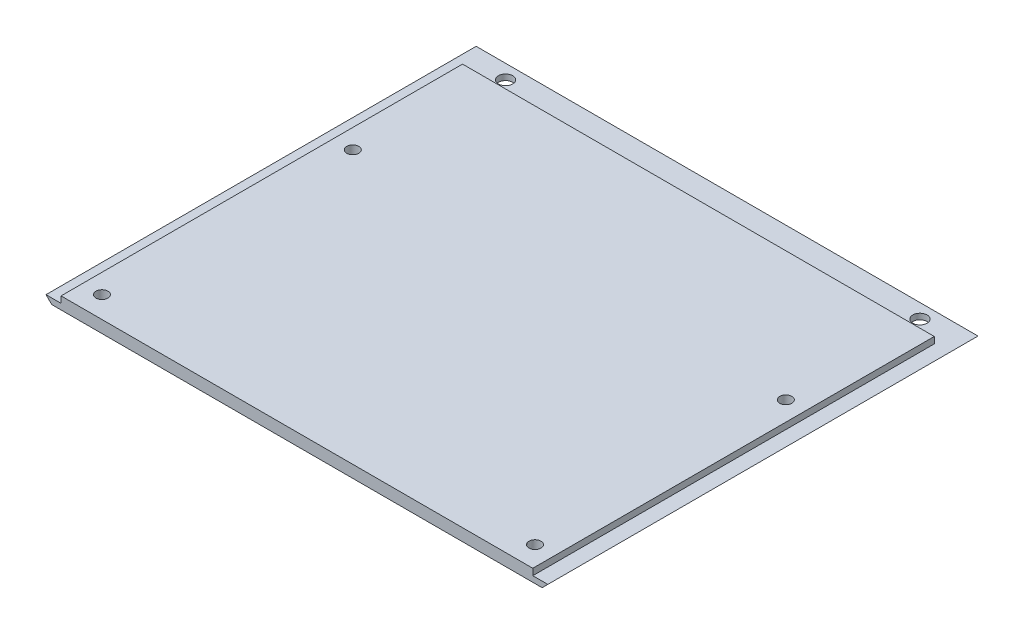
ISO-10303-21;
HEADER;
FILE_DESCRIPTION(('STEP AP214'),'2;1');
FILE_NAME('part.step','',(''),(''),'','','');
FILE_SCHEMA(('AUTOMOTIVE_DESIGN { 1 0 10303 214 1 1 1 1 }'));
ENDSEC;
DATA;
#1=APPLICATION_CONTEXT('core data for automotive mechanical design processes');
#2=APPLICATION_PROTOCOL_DEFINITION('international standard','automotive_design',2000,#1);
#3=PRODUCT_CONTEXT('',#1,'mechanical');
#4=PRODUCT('Part','Part','',(#3));
#5=PRODUCT_RELATED_PRODUCT_CATEGORY('part','',(#4));
#6=PRODUCT_DEFINITION_FORMATION('','',#4);
#7=PRODUCT_DEFINITION_CONTEXT('part definition',#1,'design');
#8=PRODUCT_DEFINITION('design','',#6,#7);
#9=PRODUCT_DEFINITION_SHAPE('','',#8);
#10=(LENGTH_UNIT() NAMED_UNIT(*) SI_UNIT(.MILLI.,.METRE.));
#11=(NAMED_UNIT(*) PLANE_ANGLE_UNIT() SI_UNIT($,.RADIAN.));
#12=(NAMED_UNIT(*) SI_UNIT($,.STERADIAN.) SOLID_ANGLE_UNIT());
#13=UNCERTAINTY_MEASURE_WITH_UNIT(LENGTH_MEASURE(1.E-05),#10,'distance_accuracy_value','');
#14=(GEOMETRIC_REPRESENTATION_CONTEXT(3) GLOBAL_UNCERTAINTY_ASSIGNED_CONTEXT((#13)) GLOBAL_UNIT_ASSIGNED_CONTEXT((#10,
#11,#12)) REPRESENTATION_CONTEXT('',''));
#15=CARTESIAN_POINT('',(0.,0.,0.));
#16=DIRECTION('',(0.,0.,1.));
#17=DIRECTION('',(1.,0.,0.));
#18=AXIS2_PLACEMENT_3D('',#15,#16,#17);
#19=CARTESIAN_POINT('',(-87.51,-2.,-9.99999999999999));
#20=DIRECTION('',(0.,0.,-1.));
#21=DIRECTION('',(0.,1.,0.));
#22=AXIS2_PLACEMENT_3D('',#19,#20,#21);
#23=PLANE('',#22);
#24=DIRECTION('',(0.70710678118654,-0.707106781186555,0.));
#25=VECTOR('',#24,1.);
#26=CARTESIAN_POINT('',(-85.5000000000001,-1.9999999999999,-9.99999999999999));
#27=LINE('',#26,#25);
#28=CARTESIAN_POINT('',(-87.5,0.,-9.99999999999998));
#29=VERTEX_POINT('',#28);
#30=CARTESIAN_POINT('',(-85.5,-2.,-9.99999999999999));
#31=VERTEX_POINT('',#30);
#32=EDGE_CURVE('E186',#29,#31,#27,.T.);
#33=ORIENTED_EDGE('',*,*,#32,.F.);
#34=DIRECTION('',(1.,0.,0.));
#35=VECTOR('',#34,1.);
#36=CARTESIAN_POINT('',(-87.51,0.,-10.));
#37=LINE('',#36,#35);
#38=CARTESIAN_POINT('',(87.5,0.,-9.99999999999999));
#39=VERTEX_POINT('',#38);
#40=EDGE_CURVE('E46',#29,#39,#37,.T.);
#41=ORIENTED_EDGE('',*,*,#40,.T.);
#42=DIRECTION('',(0.707106781186539,0.707106781186556,0.));
#43=VECTOR('',#42,1.);
#44=CARTESIAN_POINT('',(85.5000000000001,-1.9999999999999,-9.99999999999999));
#45=LINE('',#44,#43);
#46=CARTESIAN_POINT('',(85.5,-2.,-10.));
#47=VERTEX_POINT('',#46);
#48=EDGE_CURVE('E183',#47,#39,#45,.T.);
#49=ORIENTED_EDGE('',*,*,#48,.F.);
#50=DIRECTION('',(1.,0.,0.));
#51=VECTOR('',#50,1.);
#52=CARTESIAN_POINT('',(0.,-2.,-9.99999999999999));
#53=LINE('',#52,#51);
#54=EDGE_CURVE('E188',#31,#47,#53,.T.);
#55=ORIENTED_EDGE('',*,*,#54,.F.);
#56=EDGE_LOOP('',(#33,#41,#49,#55));
#57=FACE_BOUND('',#56,.T.);
#58=ADVANCED_FACE('F37',(#57),#23,.T.);
#59=CARTESIAN_POINT('',(-87.51,0.,-10.));
#60=DIRECTION('',(0.,1.,0.));
#61=DIRECTION('',(0.,0.,1.));
#62=AXIS2_PLACEMENT_3D('',#59,#60,#61);
#63=PLANE('',#62);
#64=CARTESIAN_POINT('',(72.2500000000001,0.,-5.00000000000002));
#65=DIRECTION('',(0.,1.,0.));
#66=DIRECTION('',(0.,0.,1.));
#67=AXIS2_PLACEMENT_3D('',#64,#65,#66);
#68=CIRCLE('',#67,2.5);
#69=CARTESIAN_POINT('',(72.2500000000001,0.,-2.50000000000002));
#70=VERTEX_POINT('',#69);
#71=EDGE_CURVE('E133',#70,#70,#68,.T.);
#72=ORIENTED_EDGE('',*,*,#71,.F.);
#73=EDGE_LOOP('',(#72));
#74=FACE_BOUND('',#73,.T.);
#75=CARTESIAN_POINT('',(-72.2500000000001,0.,-5.00000000000002));
#76=DIRECTION('',(0.,1.,0.));
#77=DIRECTION('',(0.,0.,-1.));
#78=AXIS2_PLACEMENT_3D('',#75,#76,#77);
#79=CIRCLE('',#78,2.5);
#80=CARTESIAN_POINT('',(-72.2500000000001,0.,-7.50000000000001));
#81=VERTEX_POINT('',#80);
#82=EDGE_CURVE('E301',#81,#81,#79,.T.);
#83=ORIENTED_EDGE('',*,*,#82,.F.);
#84=EDGE_LOOP('',(#83));
#85=FACE_BOUND('',#84,.T.);
#86=ORIENTED_EDGE('',*,*,#40,.F.);
#87=DIRECTION('',(0.,0.,-1.));
#88=VECTOR('',#87,1.);
#89=CARTESIAN_POINT('',(-87.5,0.,140.));
#90=LINE('',#89,#88);
#91=CARTESIAN_POINT('',(-87.5,0.,140.));
#92=VERTEX_POINT('',#91);
#93=EDGE_CURVE('E41',#92,#29,#90,.T.);
#94=ORIENTED_EDGE('',*,*,#93,.F.);
#95=DIRECTION('',(-1.,0.,0.));
#96=VECTOR('',#95,1.);
#97=CARTESIAN_POINT('',(87.5,0.,140.));
#98=LINE('',#97,#96);
#99=CARTESIAN_POINT('',(-82.25,0.,140.));
#100=VERTEX_POINT('',#99);
#101=EDGE_CURVE('E62',#100,#92,#98,.T.);
#102=ORIENTED_EDGE('',*,*,#101,.F.);
#103=DIRECTION('',(0.,0.,-1.));
#104=VECTOR('',#103,1.);
#105=CARTESIAN_POINT('',(-82.25,0.,-124.813107271121));
#106=LINE('',#105,#104);
#107=CARTESIAN_POINT('',(-82.25,0.,0.));
#108=VERTEX_POINT('',#107);
#109=EDGE_CURVE('E155',#100,#108,#106,.T.);
#110=ORIENTED_EDGE('',*,*,#109,.T.);
#111=DIRECTION('',(1.,0.,0.));
#112=VECTOR('',#111,1.);
#113=CARTESIAN_POINT('',(-87.51,0.,0.));
#114=LINE('',#113,#112);
#115=CARTESIAN_POINT('',(82.2500000000001,0.,0.));
#116=VERTEX_POINT('',#115);
#117=EDGE_CURVE('E11',#108,#116,#114,.T.);
#118=ORIENTED_EDGE('',*,*,#117,.T.);
#119=DIRECTION('',(0.,0.,1.));
#120=VECTOR('',#119,1.);
#121=CARTESIAN_POINT('',(82.25,0.,140.));
#122=LINE('',#121,#120);
#123=CARTESIAN_POINT('',(82.2500000000001,0.,140.));
#124=VERTEX_POINT('',#123);
#125=EDGE_CURVE('E123',#116,#124,#122,.T.);
#126=ORIENTED_EDGE('',*,*,#125,.T.);
#127=CARTESIAN_POINT('',(87.5,0.,140.));
#128=VERTEX_POINT('',#127);
#129=EDGE_CURVE('E146',#128,#124,#98,.T.);
#130=ORIENTED_EDGE('',*,*,#129,.F.);
#131=DIRECTION('',(0.,0.,1.));
#132=VECTOR('',#131,1.);
#133=CARTESIAN_POINT('',(87.5,0.,-129.39976452297));
#134=LINE('',#133,#132);
#135=EDGE_CURVE('E54',#39,#128,#134,.T.);
#136=ORIENTED_EDGE('',*,*,#135,.F.);
#137=EDGE_LOOP('',(#86,#94,#102,#110,#118,#126,#130,#136));
#138=FACE_BOUND('',#137,.T.);
#139=ADVANCED_FACE('F194',(#74,#85,#138),#63,.T.);
#140=CARTESIAN_POINT('',(-87.51,0.,0.));
#141=DIRECTION('',(0.,0.,-1.));
#142=DIRECTION('',(0.,1.,0.));
#143=AXIS2_PLACEMENT_3D('',#140,#141,#142);
#144=PLANE('',#143);
#145=DIRECTION('',(0.,1.,0.));
#146=VECTOR('',#145,1.);
#147=CARTESIAN_POINT('',(82.2500000000001,2.24999999999914,0.));
#148=LINE('',#147,#146);
#149=CARTESIAN_POINT('',(82.2500000000001,2.25,0.));
#150=VERTEX_POINT('',#149);
#151=EDGE_CURVE('E121',#116,#150,#148,.T.);
#152=ORIENTED_EDGE('',*,*,#151,.F.);
#153=ORIENTED_EDGE('',*,*,#117,.F.);
#154=DIRECTION('',(0.,-1.,0.));
#155=VECTOR('',#154,1.);
#156=CARTESIAN_POINT('',(-82.25,2.25000000000077,0.));
#157=LINE('',#156,#155);
#158=CARTESIAN_POINT('',(-82.25,2.25,0.));
#159=VERTEX_POINT('',#158);
#160=EDGE_CURVE('E125',#159,#108,#157,.T.);
#161=ORIENTED_EDGE('',*,*,#160,.F.);
#162=DIRECTION('',(1.,0.,0.));
#163=VECTOR('',#162,1.);
#164=CARTESIAN_POINT('',(-0.000440445540175055,2.25,0.));
#165=LINE('',#164,#163);
#166=EDGE_CURVE('E110',#159,#150,#165,.T.);
#167=ORIENTED_EDGE('',*,*,#166,.T.);
#168=EDGE_LOOP('',(#152,#153,#161,#167));
#169=FACE_BOUND('',#168,.T.);
#170=ADVANCED_FACE('F128',(#169),#144,.T.);
#171=CARTESIAN_POINT('',(-82.25,2.25,-124.813107271121));
#172=DIRECTION('',(-1.,0.,0.));
#173=DIRECTION('',(0.,0.,1.));
#174=AXIS2_PLACEMENT_3D('',#171,#172,#173);
#175=PLANE('',#174);
#176=DIRECTION('',(0.,0.,-1.));
#177=VECTOR('',#176,1.);
#178=CARTESIAN_POINT('',(-82.25,2.25,-124.813107271121));
#179=LINE('',#178,#177);
#180=CARTESIAN_POINT('',(-82.25,2.25,140.));
#181=VERTEX_POINT('',#180);
#182=EDGE_CURVE('E116',#181,#159,#179,.T.);
#183=ORIENTED_EDGE('',*,*,#182,.T.);
#184=ORIENTED_EDGE('',*,*,#160,.T.);
#185=ORIENTED_EDGE('',*,*,#109,.F.);
#186=DIRECTION('',(0.,-1.,0.));
#187=VECTOR('',#186,1.);
#188=CARTESIAN_POINT('',(-82.25,2.25,140.));
#189=LINE('',#188,#187);
#190=EDGE_CURVE('E117',#181,#100,#189,.T.);
#191=ORIENTED_EDGE('',*,*,#190,.F.);
#192=EDGE_LOOP('',(#183,#184,#185,#191));
#193=FACE_BOUND('',#192,.T.);
#194=ADVANCED_FACE('F192',(#193),#175,.T.);
#195=CARTESIAN_POINT('',(82.25,2.25,140.));
#196=DIRECTION('',(1.,0.,0.));
#197=DIRECTION('',(0.,0.,-1.));
#198=AXIS2_PLACEMENT_3D('',#195,#196,#197);
#199=PLANE('',#198);
#200=ORIENTED_EDGE('',*,*,#125,.F.);
#201=ORIENTED_EDGE('',*,*,#151,.T.);
#202=DIRECTION('',(0.,0.,1.));
#203=VECTOR('',#202,1.);
#204=CARTESIAN_POINT('',(82.25,2.25,140.));
#205=LINE('',#204,#203);
#206=CARTESIAN_POINT('',(82.25,2.25,140.));
#207=VERTEX_POINT('',#206);
#208=EDGE_CURVE('E105',#150,#207,#205,.T.);
#209=ORIENTED_EDGE('',*,*,#208,.T.);
#210=DIRECTION('',(0.,-1.,0.));
#211=VECTOR('',#210,1.);
#212=CARTESIAN_POINT('',(82.25,2.25,140.));
#213=LINE('',#212,#211);
#214=EDGE_CURVE('E142',#207,#124,#213,.T.);
#215=ORIENTED_EDGE('',*,*,#214,.T.);
#216=EDGE_LOOP('',(#200,#201,#209,#215));
#217=FACE_BOUND('',#216,.T.);
#218=ADVANCED_FACE('F122',(#217),#199,.T.);
#219=CARTESIAN_POINT('',(75.5,2.251,45.018802153517));
#220=DIRECTION('',(0.,-1.,0.));
#221=DIRECTION('',(0.,0.,-1.));
#222=AXIS2_PLACEMENT_3D('',#219,#220,#221);
#223=CYLINDRICAL_SURFACE('',#222,2.1);
#224=CARTESIAN_POINT('',(75.5,-2.,45.018802153517));
#225=DIRECTION('',(0.,-1.,0.));
#226=DIRECTION('',(0.,0.,-1.));
#227=AXIS2_PLACEMENT_3D('',#224,#225,#226);
#228=CIRCLE('',#227,2.1);
#229=CARTESIAN_POINT('',(75.5,-2.,42.918802153517));
#230=VERTEX_POINT('',#229);
#231=EDGE_CURVE('E167',#230,#230,#228,.T.);
#232=ORIENTED_EDGE('',*,*,#231,.T.);
#233=EDGE_LOOP('',(#232));
#234=FACE_BOUND('',#233,.T.);
#235=CARTESIAN_POINT('',(75.5,2.25,45.018802153517));
#236=DIRECTION('',(0.,-1.,0.));
#237=DIRECTION('',(0.,0.,-1.));
#238=AXIS2_PLACEMENT_3D('',#235,#236,#237);
#239=CIRCLE('',#238,2.1);
#240=CARTESIAN_POINT('',(75.5,2.25,42.918802153517));
#241=VERTEX_POINT('',#240);
#242=EDGE_CURVE('E145',#241,#241,#239,.F.);
#243=ORIENTED_EDGE('',*,*,#242,.T.);
#244=EDGE_LOOP('',(#243));
#245=FACE_BOUND('',#244,.T.);
#246=ADVANCED_FACE('F227',(#234,#245),#223,.F.);
#247=CARTESIAN_POINT('',(75.5,2.251,132.481197846483));
#248=DIRECTION('',(0.,-1.,0.));
#249=DIRECTION('',(0.,0.,-1.));
#250=AXIS2_PLACEMENT_3D('',#247,#248,#249);
#251=CYLINDRICAL_SURFACE('',#250,2.1);
#252=CARTESIAN_POINT('',(75.5,-2.,132.481197846483));
#253=DIRECTION('',(0.,-1.,0.));
#254=DIRECTION('',(0.,0.,-1.));
#255=AXIS2_PLACEMENT_3D('',#252,#253,#254);
#256=CIRCLE('',#255,2.1);
#257=CARTESIAN_POINT('',(75.5,-2.,130.381197846483));
#258=VERTEX_POINT('',#257);
#259=EDGE_CURVE('E160',#258,#258,#256,.T.);
#260=ORIENTED_EDGE('',*,*,#259,.T.);
#261=EDGE_LOOP('',(#260));
#262=FACE_BOUND('',#261,.T.);
#263=CARTESIAN_POINT('',(75.5,2.25,132.481197846483));
#264=DIRECTION('',(0.,-1.,0.));
#265=DIRECTION('',(0.,0.,-1.));
#266=AXIS2_PLACEMENT_3D('',#263,#264,#265);
#267=CIRCLE('',#266,2.1);
#268=CARTESIAN_POINT('',(75.5,2.25,130.381197846483));
#269=VERTEX_POINT('',#268);
#270=EDGE_CURVE('E164',#269,#269,#267,.F.);
#271=ORIENTED_EDGE('',*,*,#270,.T.);
#272=EDGE_LOOP('',(#271));
#273=FACE_BOUND('',#272,.T.);
#274=ADVANCED_FACE('F256',(#262,#273),#251,.F.);
#275=CARTESIAN_POINT('',(-75.5,2.251,132.481197846483));
#276=DIRECTION('',(0.,-1.,0.));
#277=DIRECTION('',(0.,0.,-1.));
#278=AXIS2_PLACEMENT_3D('',#275,#276,#277);
#279=CYLINDRICAL_SURFACE('',#278,2.1);
#280=CARTESIAN_POINT('',(-75.5,-2.,132.481197846483));
#281=DIRECTION('',(0.,-1.,0.));
#282=DIRECTION('',(0.,0.,1.));
#283=AXIS2_PLACEMENT_3D('',#280,#281,#282);
#284=CIRCLE('',#283,2.1);
#285=CARTESIAN_POINT('',(-75.5,-2.,134.581197846483));
#286=VERTEX_POINT('',#285);
#287=EDGE_CURVE('E159',#286,#286,#284,.T.);
#288=ORIENTED_EDGE('',*,*,#287,.T.);
#289=EDGE_LOOP('',(#288));
#290=FACE_BOUND('',#289,.T.);
#291=CARTESIAN_POINT('',(-75.5,2.25,132.481197846483));
#292=DIRECTION('',(0.,-1.,0.));
#293=DIRECTION('',(0.,0.,-1.));
#294=AXIS2_PLACEMENT_3D('',#291,#292,#293);
#295=CIRCLE('',#294,2.1);
#296=CARTESIAN_POINT('',(-75.5,2.25,130.381197846483));
#297=VERTEX_POINT('',#296);
#298=EDGE_CURVE('E156',#297,#297,#295,.F.);
#299=ORIENTED_EDGE('',*,*,#298,.T.);
#300=EDGE_LOOP('',(#299));
#301=FACE_BOUND('',#300,.T.);
#302=ADVANCED_FACE('F262',(#290,#301),#279,.F.);
#303=CARTESIAN_POINT('',(-75.5,2.251,45.018802153517));
#304=DIRECTION('',(0.,-1.,0.));
#305=DIRECTION('',(0.,0.,-1.));
#306=AXIS2_PLACEMENT_3D('',#303,#304,#305);
#307=CYLINDRICAL_SURFACE('',#306,2.1);
#308=CARTESIAN_POINT('',(-75.5,-2.,45.018802153517));
#309=DIRECTION('',(0.,-1.,0.));
#310=DIRECTION('',(0.,0.,1.));
#311=AXIS2_PLACEMENT_3D('',#308,#309,#310);
#312=CIRCLE('',#311,2.1);
#313=CARTESIAN_POINT('',(-75.5,-2.,47.118802153517));
#314=VERTEX_POINT('',#313);
#315=EDGE_CURVE('E176',#314,#314,#312,.T.);
#316=ORIENTED_EDGE('',*,*,#315,.T.);
#317=EDGE_LOOP('',(#316));
#318=FACE_BOUND('',#317,.T.);
#319=CARTESIAN_POINT('',(-75.5,2.25,45.018802153517));
#320=DIRECTION('',(0.,-1.,0.));
#321=DIRECTION('',(0.,0.,-1.));
#322=AXIS2_PLACEMENT_3D('',#319,#320,#321);
#323=CIRCLE('',#322,2.1);
#324=CARTESIAN_POINT('',(-75.5,2.25,42.918802153517));
#325=VERTEX_POINT('',#324);
#326=EDGE_CURVE('E163',#325,#325,#323,.F.);
#327=ORIENTED_EDGE('',*,*,#326,.T.);
#328=EDGE_LOOP('',(#327));
#329=FACE_BOUND('',#328,.T.);
#330=ADVANCED_FACE('F267',(#318,#329),#307,.F.);
#331=CARTESIAN_POINT('',(82.25,2.25,140.));
#332=DIRECTION('',(0.,0.,1.));
#333=DIRECTION('',(1.,0.,0.));
#334=AXIS2_PLACEMENT_3D('',#331,#332,#333);
#335=PLANE('',#334);
#336=DIRECTION('',(-1.,0.,0.));
#337=VECTOR('',#336,1.);
#338=CARTESIAN_POINT('',(87.5,-2.,140.));
#339=LINE('',#338,#337);
#340=CARTESIAN_POINT('',(85.5,-2.,140.));
#341=VERTEX_POINT('',#340);
#342=CARTESIAN_POINT('',(-85.5,-2.,140.));
#343=VERTEX_POINT('',#342);
#344=EDGE_CURVE('E149',#341,#343,#339,.T.);
#345=ORIENTED_EDGE('',*,*,#344,.F.);
#346=DIRECTION('',(0.707106781186539,0.707106781186556,0.));
#347=VECTOR('',#346,1.);
#348=CARTESIAN_POINT('',(86.0000000000001,-1.49999999999995,140.));
#349=LINE('',#348,#347);
#350=EDGE_CURVE('E185',#341,#128,#349,.T.);
#351=ORIENTED_EDGE('',*,*,#350,.T.);
#352=ORIENTED_EDGE('',*,*,#129,.T.);
#353=ORIENTED_EDGE('',*,*,#214,.F.);
#354=DIRECTION('',(-1.,0.,0.));
#355=VECTOR('',#354,1.);
#356=CARTESIAN_POINT('',(82.25,2.25,140.));
#357=LINE('',#356,#355);
#358=EDGE_CURVE('E112',#207,#181,#357,.T.);
#359=ORIENTED_EDGE('',*,*,#358,.T.);
#360=ORIENTED_EDGE('',*,*,#190,.T.);
#361=ORIENTED_EDGE('',*,*,#101,.T.);
#362=DIRECTION('',(0.70710678118654,-0.707106781186555,0.));
#363=VECTOR('',#362,1.);
#364=CARTESIAN_POINT('',(-3.75000000000165,-83.75,140.));
#365=LINE('',#364,#363);
#366=EDGE_CURVE('E140',#92,#343,#365,.T.);
#367=ORIENTED_EDGE('',*,*,#366,.T.);
#368=EDGE_LOOP('',(#345,#351,#352,#353,#359,#360,#361,#367));
#369=FACE_BOUND('',#368,.T.);
#370=ADVANCED_FACE('F205',(#369),#335,.T.);
#371=CARTESIAN_POINT('',(0.,-2.,-91.9988226148516));
#372=DIRECTION('',(0.,-1.,0.));
#373=DIRECTION('',(0.,0.,-1.));
#374=AXIS2_PLACEMENT_3D('',#371,#372,#373);
#375=PLANE('',#374);
#376=CARTESIAN_POINT('',(72.2500000000001,-2.,-5.00000000000002));
#377=DIRECTION('',(0.,1.,0.));
#378=DIRECTION('',(0.,0.,1.));
#379=AXIS2_PLACEMENT_3D('',#376,#377,#378);
#380=CIRCLE('',#379,2.5);
#381=CARTESIAN_POINT('',(72.2500000000001,-2.,-2.50000000000002));
#382=VERTEX_POINT('',#381);
#383=EDGE_CURVE('E130',#382,#382,#380,.T.);
#384=ORIENTED_EDGE('',*,*,#383,.T.);
#385=EDGE_LOOP('',(#384));
#386=FACE_BOUND('',#385,.T.);
#387=CARTESIAN_POINT('',(-72.2500000000001,-2.,-5.00000000000002));
#388=DIRECTION('',(0.,1.,0.));
#389=DIRECTION('',(0.,0.,-1.));
#390=AXIS2_PLACEMENT_3D('',#387,#388,#389);
#391=CIRCLE('',#390,2.5);
#392=CARTESIAN_POINT('',(-72.2500000000001,-2.,-7.50000000000001));
#393=VERTEX_POINT('',#392);
#394=EDGE_CURVE('E298',#393,#393,#391,.T.);
#395=ORIENTED_EDGE('',*,*,#394,.T.);
#396=EDGE_LOOP('',(#395));
#397=FACE_BOUND('',#396,.T.);
#398=ORIENTED_EDGE('',*,*,#315,.F.);
#399=EDGE_LOOP('',(#398));
#400=FACE_BOUND('',#399,.T.);
#401=ORIENTED_EDGE('',*,*,#287,.F.);
#402=EDGE_LOOP('',(#401));
#403=FACE_BOUND('',#402,.T.);
#404=ORIENTED_EDGE('',*,*,#259,.F.);
#405=EDGE_LOOP('',(#404));
#406=FACE_BOUND('',#405,.T.);
#407=ORIENTED_EDGE('',*,*,#231,.F.);
#408=EDGE_LOOP('',(#407));
#409=FACE_BOUND('',#408,.T.);
#410=DIRECTION('',(0.,0.,-1.));
#411=VECTOR('',#410,1.);
#412=CARTESIAN_POINT('',(-85.5,-2.,-129.39976452297));
#413=LINE('',#412,#411);
#414=EDGE_CURVE('E139',#343,#31,#413,.T.);
#415=ORIENTED_EDGE('',*,*,#414,.T.);
#416=ORIENTED_EDGE('',*,*,#54,.T.);
#417=DIRECTION('',(0.,0.,1.));
#418=VECTOR('',#417,1.);
#419=CARTESIAN_POINT('',(85.5,-2.,140.));
#420=LINE('',#419,#418);
#421=EDGE_CURVE('E137',#47,#341,#420,.T.);
#422=ORIENTED_EDGE('',*,*,#421,.T.);
#423=ORIENTED_EDGE('',*,*,#344,.T.);
#424=EDGE_LOOP('',(#415,#416,#422,#423));
#425=FACE_BOUND('',#424,.T.);
#426=ADVANCED_FACE('F209',(#386,#397,#400,#403,#406,#409,#425),#375,.T.);
#427=CARTESIAN_POINT('',(85.5,-2.,-91.9988226148516));
#428=DIRECTION('',(0.707106781186556,-0.707106781186539,0.));
#429=DIRECTION('',(0.,0.,-1.));
#430=AXIS2_PLACEMENT_3D('',#427,#428,#429);
#431=PLANE('',#430);
#432=ORIENTED_EDGE('',*,*,#421,.F.);
#433=ORIENTED_EDGE('',*,*,#48,.T.);
#434=ORIENTED_EDGE('',*,*,#135,.T.);
#435=ORIENTED_EDGE('',*,*,#350,.F.);
#436=EDGE_LOOP('',(#432,#433,#434,#435));
#437=FACE_BOUND('',#436,.T.);
#438=ADVANCED_FACE('F207',(#437),#431,.T.);
#439=CARTESIAN_POINT('',(-85.5,-2.,-91.9988226148516));
#440=DIRECTION('',(-0.707106781186555,-0.70710678118654,0.));
#441=DIRECTION('',(0.,0.,1.));
#442=AXIS2_PLACEMENT_3D('',#439,#440,#441);
#443=PLANE('',#442);
#444=ORIENTED_EDGE('',*,*,#93,.T.);
#445=ORIENTED_EDGE('',*,*,#32,.T.);
#446=ORIENTED_EDGE('',*,*,#414,.F.);
#447=ORIENTED_EDGE('',*,*,#366,.F.);
#448=EDGE_LOOP('',(#444,#445,#446,#447));
#449=FACE_BOUND('',#448,.T.);
#450=ADVANCED_FACE('F39',(#449),#443,.T.);
#451=CARTESIAN_POINT('',(-0.000440445540175055,2.25,-91.9949855904792));
#452=DIRECTION('',(0.,-1.,0.));
#453=DIRECTION('',(0.,0.,-1.));
#454=AXIS2_PLACEMENT_3D('',#451,#452,#453);
#455=PLANE('',#454);
#456=ORIENTED_EDGE('',*,*,#326,.F.);
#457=EDGE_LOOP('',(#456));
#458=FACE_BOUND('',#457,.T.);
#459=ORIENTED_EDGE('',*,*,#298,.F.);
#460=EDGE_LOOP('',(#459));
#461=FACE_BOUND('',#460,.T.);
#462=ORIENTED_EDGE('',*,*,#270,.F.);
#463=EDGE_LOOP('',(#462));
#464=FACE_BOUND('',#463,.T.);
#465=ORIENTED_EDGE('',*,*,#242,.F.);
#466=EDGE_LOOP('',(#465));
#467=FACE_BOUND('',#466,.T.);
#468=ORIENTED_EDGE('',*,*,#166,.F.);
#469=ORIENTED_EDGE('',*,*,#182,.F.);
#470=ORIENTED_EDGE('',*,*,#358,.F.);
#471=ORIENTED_EDGE('',*,*,#208,.F.);
#472=EDGE_LOOP('',(#468,#469,#470,#471));
#473=FACE_BOUND('',#472,.T.);
#474=ADVANCED_FACE('F107',(#458,#461,#464,#467,#473),#455,.F.);
#475=CARTESIAN_POINT('',(-72.2500000000001,-2.,-5.00000000000002));
#476=DIRECTION('',(0.,1.,0.));
#477=DIRECTION('',(0.,0.,1.));
#478=AXIS2_PLACEMENT_3D('',#475,#476,#477);
#479=CYLINDRICAL_SURFACE('',#478,2.5);
#480=ORIENTED_EDGE('',*,*,#394,.F.);
#481=EDGE_LOOP('',(#480));
#482=FACE_BOUND('',#481,.T.);
#483=ORIENTED_EDGE('',*,*,#82,.T.);
#484=EDGE_LOOP('',(#483));
#485=FACE_BOUND('',#484,.T.);
#486=ADVANCED_FACE('F219',(#482,#485),#479,.F.);
#487=CARTESIAN_POINT('',(72.2500000000001,-2.,-5.00000000000002));
#488=DIRECTION('',(0.,1.,0.));
#489=DIRECTION('',(0.,0.,1.));
#490=AXIS2_PLACEMENT_3D('',#487,#488,#489);
#491=CYLINDRICAL_SURFACE('',#490,2.5);
#492=ORIENTED_EDGE('',*,*,#383,.F.);
#493=EDGE_LOOP('',(#492));
#494=FACE_BOUND('',#493,.T.);
#495=ORIENTED_EDGE('',*,*,#71,.T.);
#496=EDGE_LOOP('',(#495));
#497=FACE_BOUND('',#496,.T.);
#498=ADVANCED_FACE('F244',(#494,#497),#491,.F.);
#499=CLOSED_SHELL('',(#58,#139,#170,#194,#218,#246,#274,#302,#330,#370,#426,#438,#450,#474,#486,#498));
#500=MANIFOLD_SOLID_BREP('B2',#499);
#501=ADVANCED_BREP_SHAPE_REPRESENTATION('',(#18,#500),#14);
#502=SHAPE_DEFINITION_REPRESENTATION(#9,#501);
ENDSEC;
END-ISO-10303-21;
